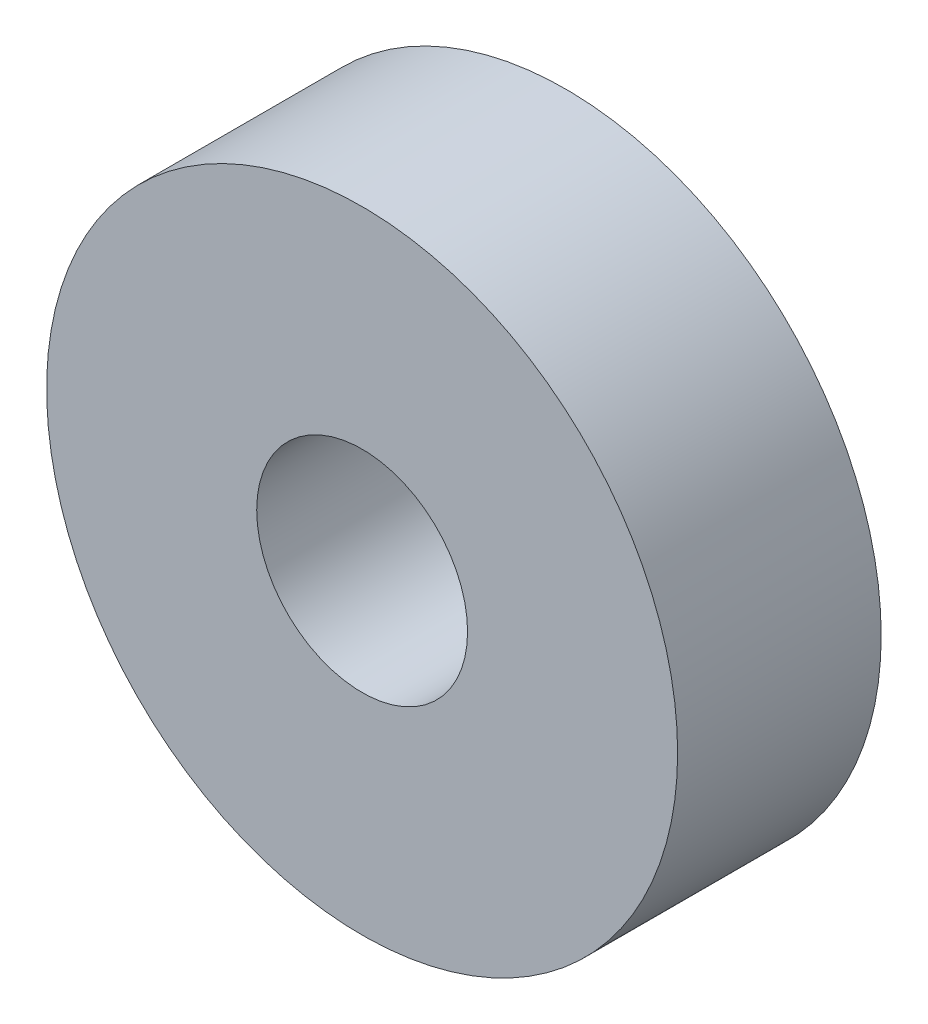
ISO-10303-21;
HEADER;
FILE_DESCRIPTION(('STEP AP214'),'2;1');
FILE_NAME('part.step','',(''),(''),'','','');
FILE_SCHEMA(('AUTOMOTIVE_DESIGN { 1 0 10303 214 1 1 1 1 }'));
ENDSEC;
DATA;
#1=APPLICATION_CONTEXT('core data for automotive mechanical design processes');
#2=APPLICATION_PROTOCOL_DEFINITION('international standard','automotive_design',2000,#1);
#3=PRODUCT_CONTEXT('',#1,'mechanical');
#4=PRODUCT('Part','Part','',(#3));
#5=PRODUCT_RELATED_PRODUCT_CATEGORY('part','',(#4));
#6=PRODUCT_DEFINITION_FORMATION('','',#4);
#7=PRODUCT_DEFINITION_CONTEXT('part definition',#1,'design');
#8=PRODUCT_DEFINITION('design','',#6,#7);
#9=PRODUCT_DEFINITION_SHAPE('','',#8);
#10=(LENGTH_UNIT() NAMED_UNIT(*) SI_UNIT(.MILLI.,.METRE.));
#11=(NAMED_UNIT(*) PLANE_ANGLE_UNIT() SI_UNIT($,.RADIAN.));
#12=(NAMED_UNIT(*) SI_UNIT($,.STERADIAN.) SOLID_ANGLE_UNIT());
#13=UNCERTAINTY_MEASURE_WITH_UNIT(LENGTH_MEASURE(1.E-05),#10,'distance_accuracy_value','');
#14=(GEOMETRIC_REPRESENTATION_CONTEXT(3) GLOBAL_UNCERTAINTY_ASSIGNED_CONTEXT((#13)) GLOBAL_UNIT_ASSIGNED_CONTEXT((#10,
#11,#12)) REPRESENTATION_CONTEXT('',''));
#15=CARTESIAN_POINT('',(0.,0.,0.));
#16=DIRECTION('',(0.,0.,1.));
#17=DIRECTION('',(1.,0.,0.));
#18=AXIS2_PLACEMENT_3D('',#15,#16,#17);
#19=CARTESIAN_POINT('',(0.,0.,0.));
#20=DIRECTION('',(0.,0.,1.));
#21=DIRECTION('',(1.,0.,0.));
#22=AXIS2_PLACEMENT_3D('',#19,#20,#21);
#23=PLANE('',#22);
#24=CARTESIAN_POINT('',(0.,0.,0.));
#25=DIRECTION('',(0.,0.,1.));
#26=DIRECTION('',(1.,0.,0.));
#27=AXIS2_PLACEMENT_3D('',#24,#25,#26);
#28=CIRCLE('',#27,2.59);
#29=CARTESIAN_POINT('',(2.59,0.,0.));
#30=VERTEX_POINT('',#29);
#31=EDGE_CURVE('E52',#30,#30,#28,.T.);
#32=ORIENTED_EDGE('',*,*,#31,.T.);
#33=EDGE_LOOP('',(#32));
#34=FACE_BOUND('',#33,.T.);
#35=CARTESIAN_POINT('',(0.,0.,0.));
#36=DIRECTION('',(0.,0.,-1.));
#37=DIRECTION('',(-1.,0.,0.));
#38=AXIS2_PLACEMENT_3D('',#35,#36,#37);
#39=CIRCLE('',#38,3.5);
#40=CARTESIAN_POINT('',(-3.5,0.,0.));
#41=VERTEX_POINT('',#40);
#42=EDGE_CURVE('E68',#41,#41,#39,.T.);
#43=ORIENTED_EDGE('',*,*,#42,.T.);
#44=EDGE_LOOP('',(#43));
#45=FACE_BOUND('',#44,.T.);
#46=ADVANCED_FACE('F37',(#34,#45),#23,.F.);
#47=CARTESIAN_POINT('',(0.,0.,5.));
#48=DIRECTION('',(0.,0.,1.));
#49=DIRECTION('',(1.,0.,0.));
#50=AXIS2_PLACEMENT_3D('',#47,#48,#49);
#51=PLANE('',#50);
#52=CARTESIAN_POINT('',(0.,0.,5.));
#53=DIRECTION('',(0.,0.,1.));
#54=DIRECTION('',(1.,0.,0.));
#55=AXIS2_PLACEMENT_3D('',#52,#53,#54);
#56=CIRCLE('',#55,7.75);
#57=CARTESIAN_POINT('',(7.75,0.,5.));
#58=VERTEX_POINT('',#57);
#59=EDGE_CURVE('E10',#58,#58,#56,.T.);
#60=ORIENTED_EDGE('',*,*,#59,.T.);
#61=EDGE_LOOP('',(#60));
#62=FACE_BOUND('',#61,.T.);
#63=CARTESIAN_POINT('',(0.,0.,5.));
#64=DIRECTION('',(0.,0.,1.));
#65=DIRECTION('',(1.,0.,0.));
#66=AXIS2_PLACEMENT_3D('',#63,#64,#65);
#67=CIRCLE('',#66,2.59);
#68=CARTESIAN_POINT('',(2.59,0.,5.));
#69=VERTEX_POINT('',#68);
#70=EDGE_CURVE('E50',#69,#69,#67,.T.);
#71=ORIENTED_EDGE('',*,*,#70,.F.);
#72=EDGE_LOOP('',(#71));
#73=FACE_BOUND('',#72,.T.);
#74=ADVANCED_FACE('F95',(#62,#73),#51,.T.);
#75=CARTESIAN_POINT('',(0.,0.,0.));
#76=DIRECTION('',(0.,0.,-1.));
#77=DIRECTION('',(-1.,0.,0.));
#78=AXIS2_PLACEMENT_3D('',#75,#76,#77);
#79=CIRCLE('',#78,6.5);
#80=CARTESIAN_POINT('',(-6.5,0.,0.));
#81=VERTEX_POINT('',#80);
#82=EDGE_CURVE('E60',#81,#81,#79,.T.);
#83=ORIENTED_EDGE('',*,*,#82,.F.);
#84=EDGE_LOOP('',(#83));
#85=FACE_BOUND('',#84,.T.);
#86=CARTESIAN_POINT('',(0.,0.,0.));
#87=DIRECTION('',(0.,0.,1.));
#88=DIRECTION('',(1.,0.,0.));
#89=AXIS2_PLACEMENT_3D('',#86,#87,#88);
#90=CIRCLE('',#89,7.75);
#91=CARTESIAN_POINT('',(7.75,0.,0.));
#92=VERTEX_POINT('',#91);
#93=EDGE_CURVE('E41',#92,#92,#90,.T.);
#94=ORIENTED_EDGE('',*,*,#93,.F.);
#95=EDGE_LOOP('',(#94));
#96=FACE_BOUND('',#95,.T.);
#97=ADVANCED_FACE('F92',(#85,#96),#23,.F.);
#98=CARTESIAN_POINT('',(0.,0.,5.));
#99=DIRECTION('',(0.,0.,-1.));
#100=DIRECTION('',(-1.,0.,0.));
#101=AXIS2_PLACEMENT_3D('',#98,#99,#100);
#102=CYLINDRICAL_SURFACE('',#101,7.75);
#103=ORIENTED_EDGE('',*,*,#59,.F.);
#104=EDGE_LOOP('',(#103));
#105=FACE_BOUND('',#104,.T.);
#106=ORIENTED_EDGE('',*,*,#93,.T.);
#107=EDGE_LOOP('',(#106));
#108=FACE_BOUND('',#107,.T.);
#109=ADVANCED_FACE('F39',(#105,#108),#102,.T.);
#110=CARTESIAN_POINT('',(0.,0.,5.));
#111=DIRECTION('',(0.,0.,-1.));
#112=DIRECTION('',(-1.,0.,0.));
#113=AXIS2_PLACEMENT_3D('',#110,#111,#112);
#114=CYLINDRICAL_SURFACE('',#113,2.59);
#115=ORIENTED_EDGE('',*,*,#70,.T.);
#116=EDGE_LOOP('',(#115));
#117=FACE_BOUND('',#116,.T.);
#118=ORIENTED_EDGE('',*,*,#31,.F.);
#119=EDGE_LOOP('',(#118));
#120=FACE_BOUND('',#119,.T.);
#121=ADVANCED_FACE('F88',(#117,#120),#114,.F.);
#122=CARTESIAN_POINT('',(0.,0.,2.));
#123=DIRECTION('',(0.,0.,-1.));
#124=DIRECTION('',(-1.,0.,0.));
#125=AXIS2_PLACEMENT_3D('',#122,#123,#124);
#126=CYLINDRICAL_SURFACE('',#125,6.5);
#127=CARTESIAN_POINT('',(0.,0.,2.));
#128=DIRECTION('',(0.,0.,-1.));
#129=DIRECTION('',(-1.,0.,0.));
#130=AXIS2_PLACEMENT_3D('',#127,#128,#129);
#131=CIRCLE('',#130,6.5);
#132=CARTESIAN_POINT('',(-6.5,0.,2.));
#133=VERTEX_POINT('',#132);
#134=EDGE_CURVE('E56',#133,#133,#131,.T.);
#135=ORIENTED_EDGE('',*,*,#134,.F.);
#136=EDGE_LOOP('',(#135));
#137=FACE_BOUND('',#136,.T.);
#138=ORIENTED_EDGE('',*,*,#82,.T.);
#139=EDGE_LOOP('',(#138));
#140=FACE_BOUND('',#139,.T.);
#141=ADVANCED_FACE('F82',(#137,#140),#126,.F.);
#142=CARTESIAN_POINT('',(0.,0.,2.));
#143=DIRECTION('',(0.,0.,-1.));
#144=DIRECTION('',(-1.,0.,0.));
#145=AXIS2_PLACEMENT_3D('',#142,#143,#144);
#146=PLANE('',#145);
#147=CARTESIAN_POINT('',(0.,0.,2.));
#148=DIRECTION('',(0.,0.,-1.));
#149=DIRECTION('',(-1.,0.,0.));
#150=AXIS2_PLACEMENT_3D('',#147,#148,#149);
#151=CIRCLE('',#150,3.5);
#152=CARTESIAN_POINT('',(-3.5,0.,2.));
#153=VERTEX_POINT('',#152);
#154=EDGE_CURVE('E64',#153,#153,#151,.T.);
#155=ORIENTED_EDGE('',*,*,#154,.F.);
#156=EDGE_LOOP('',(#155));
#157=FACE_BOUND('',#156,.T.);
#158=ORIENTED_EDGE('',*,*,#134,.T.);
#159=EDGE_LOOP('',(#158));
#160=FACE_BOUND('',#159,.T.);
#161=ADVANCED_FACE('F79',(#157,#160),#146,.T.);
#162=CARTESIAN_POINT('',(0.,0.,2.));
#163=DIRECTION('',(0.,0.,-1.));
#164=DIRECTION('',(-1.,0.,0.));
#165=AXIS2_PLACEMENT_3D('',#162,#163,#164);
#166=CYLINDRICAL_SURFACE('',#165,3.5);
#167=ORIENTED_EDGE('',*,*,#154,.T.);
#168=EDGE_LOOP('',(#167));
#169=FACE_BOUND('',#168,.T.);
#170=ORIENTED_EDGE('',*,*,#42,.F.);
#171=EDGE_LOOP('',(#170));
#172=FACE_BOUND('',#171,.T.);
#173=ADVANCED_FACE('F76',(#169,#172),#166,.T.);
#174=CLOSED_SHELL('',(#46,#74,#97,#109,#121,#141,#161,#173));
#175=MANIFOLD_SOLID_BREP('B2',#174);
#176=ADVANCED_BREP_SHAPE_REPRESENTATION('',(#18,#175),#14);
#177=SHAPE_DEFINITION_REPRESENTATION(#9,#176);
ENDSEC;
END-ISO-10303-21;
